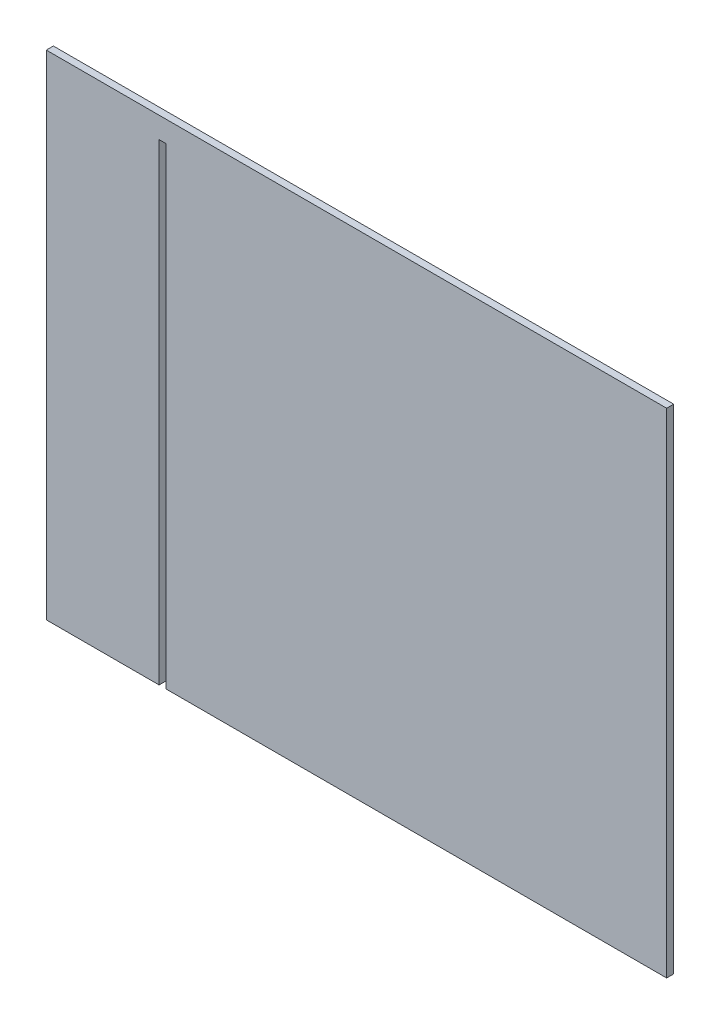
ISO-10303-21;
HEADER;
FILE_DESCRIPTION(('STEP AP214'),'2;1');
FILE_NAME('part.step','',(''),(''),'','','');
FILE_SCHEMA(('AUTOMOTIVE_DESIGN { 1 0 10303 214 1 1 1 1 }'));
ENDSEC;
DATA;
#1=APPLICATION_CONTEXT('core data for automotive mechanical design processes');
#2=APPLICATION_PROTOCOL_DEFINITION('international standard','automotive_design',2000,#1);
#3=PRODUCT_CONTEXT('',#1,'mechanical');
#4=PRODUCT('Part','Part','',(#3));
#5=PRODUCT_RELATED_PRODUCT_CATEGORY('part','',(#4));
#6=PRODUCT_DEFINITION_FORMATION('','',#4);
#7=PRODUCT_DEFINITION_CONTEXT('part definition',#1,'design');
#8=PRODUCT_DEFINITION('design','',#6,#7);
#9=PRODUCT_DEFINITION_SHAPE('','',#8);
#10=(LENGTH_UNIT() NAMED_UNIT(*) SI_UNIT(.MILLI.,.METRE.));
#11=(NAMED_UNIT(*) PLANE_ANGLE_UNIT() SI_UNIT($,.RADIAN.));
#12=(NAMED_UNIT(*) SI_UNIT($,.STERADIAN.) SOLID_ANGLE_UNIT());
#13=UNCERTAINTY_MEASURE_WITH_UNIT(LENGTH_MEASURE(1.E-05),#10,'distance_accuracy_value','');
#14=(GEOMETRIC_REPRESENTATION_CONTEXT(3) GLOBAL_UNCERTAINTY_ASSIGNED_CONTEXT((#13)) GLOBAL_UNIT_ASSIGNED_CONTEXT((#10,
#11,#12)) REPRESENTATION_CONTEXT('',''));
#15=CARTESIAN_POINT('',(0.,0.,0.));
#16=DIRECTION('',(0.,0.,1.));
#17=DIRECTION('',(1.,0.,0.));
#18=AXIS2_PLACEMENT_3D('',#15,#16,#17);
#19=CARTESIAN_POINT('',(-165.668604651163,-234.985465116279,5.));
#20=DIRECTION('',(0.,1.,0.));
#21=DIRECTION('',(0.,0.,1.));
#22=AXIS2_PLACEMENT_3D('',#19,#20,#21);
#23=PLANE('',#22);
#24=DIRECTION('',(1.,0.,0.));
#25=VECTOR('',#24,1.);
#26=CARTESIAN_POINT('',(-165.668604651163,-234.985465116279,0.));
#27=LINE('',#26,#25);
#28=CARTESIAN_POINT('',(-165.668604651163,-234.985465116279,0.));
#29=VERTEX_POINT('',#28);
#30=CARTESIAN_POINT('',(-85.6686046511627,-234.985465116279,0.));
#31=VERTEX_POINT('',#30);
#32=EDGE_CURVE('E118',#29,#31,#27,.T.);
#33=ORIENTED_EDGE('',*,*,#32,.T.);
#34=DIRECTION('',(0.,0.,1.));
#35=VECTOR('',#34,1.);
#36=CARTESIAN_POINT('',(-85.6686046511627,-234.985465116279,0.));
#37=LINE('',#36,#35);
#38=CARTESIAN_POINT('',(-85.6686046511627,-234.985465116279,5.));
#39=VERTEX_POINT('',#38);
#40=EDGE_CURVE('E106',#31,#39,#37,.T.);
#41=ORIENTED_EDGE('',*,*,#40,.T.);
#42=DIRECTION('',(1.,0.,0.));
#43=VECTOR('',#42,1.);
#44=CARTESIAN_POINT('',(-165.668604651163,-234.985465116279,5.));
#45=LINE('',#44,#43);
#46=CARTESIAN_POINT('',(-165.668604651163,-234.985465116279,5.));
#47=VERTEX_POINT('',#46);
#48=EDGE_CURVE('E84',#47,#39,#45,.T.);
#49=ORIENTED_EDGE('',*,*,#48,.F.);
#50=DIRECTION('',(0.,0.,-1.));
#51=VECTOR('',#50,1.);
#52=CARTESIAN_POINT('',(-165.668604651163,-234.985465116279,5.));
#53=LINE('',#52,#51);
#54=EDGE_CURVE('E11',#47,#29,#53,.T.);
#55=ORIENTED_EDGE('',*,*,#54,.T.);
#56=EDGE_LOOP('',(#33,#41,#49,#55));
#57=FACE_BOUND('',#56,.T.);
#58=ADVANCED_FACE('F32',(#57),#23,.F.);
#59=CARTESIAN_POINT('',(-165.668604651163,115.014534883721,5.));
#60=DIRECTION('',(1.,0.,0.));
#61=DIRECTION('',(0.,1.,0.));
#62=AXIS2_PLACEMENT_3D('',#59,#60,#61);
#63=PLANE('',#62);
#64=DIRECTION('',(0.,-1.,0.));
#65=VECTOR('',#64,1.);
#66=CARTESIAN_POINT('',(-165.668604651163,115.014534883721,0.));
#67=LINE('',#66,#65);
#68=CARTESIAN_POINT('',(-165.668604651163,115.014534883721,0.));
#69=VERTEX_POINT('',#68);
#70=EDGE_CURVE('E129',#69,#29,#67,.T.);
#71=ORIENTED_EDGE('',*,*,#70,.T.);
#72=ORIENTED_EDGE('',*,*,#54,.F.);
#73=DIRECTION('',(0.,-1.,0.));
#74=VECTOR('',#73,1.);
#75=CARTESIAN_POINT('',(-165.668604651163,115.014534883721,5.));
#76=LINE('',#75,#74);
#77=CARTESIAN_POINT('',(-165.668604651163,115.014534883721,5.));
#78=VERTEX_POINT('',#77);
#79=EDGE_CURVE('E134',#78,#47,#76,.T.);
#80=ORIENTED_EDGE('',*,*,#79,.F.);
#81=DIRECTION('',(0.,0.,-1.));
#82=VECTOR('',#81,1.);
#83=CARTESIAN_POINT('',(-165.668604651163,115.014534883721,5.));
#84=LINE('',#83,#82);
#85=EDGE_CURVE('E135',#78,#69,#84,.T.);
#86=ORIENTED_EDGE('',*,*,#85,.T.);
#87=EDGE_LOOP('',(#71,#72,#80,#86));
#88=FACE_BOUND('',#87,.T.);
#89=ADVANCED_FACE('F34',(#88),#63,.F.);
#90=CARTESIAN_POINT('',(-80.6686046511627,-234.985465116279,5.));
#91=VERTEX_POINT('',#90);
#92=CARTESIAN_POINT('',(274.331395348837,-234.985465116279,5.));
#93=VERTEX_POINT('',#92);
#94=EDGE_CURVE('E160',#91,#93,#45,.T.);
#95=ORIENTED_EDGE('',*,*,#94,.F.);
#96=DIRECTION('',(0.,0.,1.));
#97=VECTOR('',#96,1.);
#98=CARTESIAN_POINT('',(-80.6686046511627,-234.985465116279,0.));
#99=LINE('',#98,#97);
#100=CARTESIAN_POINT('',(-80.6686046511627,-234.985465116279,0.));
#101=VERTEX_POINT('',#100);
#102=EDGE_CURVE('E113',#101,#91,#99,.T.);
#103=ORIENTED_EDGE('',*,*,#102,.F.);
#104=CARTESIAN_POINT('',(274.331395348837,-234.985465116279,0.));
#105=VERTEX_POINT('',#104);
#106=EDGE_CURVE('E126',#101,#105,#27,.T.);
#107=ORIENTED_EDGE('',*,*,#106,.T.);
#108=DIRECTION('',(0.,0.,-1.));
#109=VECTOR('',#108,1.);
#110=CARTESIAN_POINT('',(274.331395348837,-234.985465116279,5.));
#111=LINE('',#110,#109);
#112=EDGE_CURVE('E40',#93,#105,#111,.T.);
#113=ORIENTED_EDGE('',*,*,#112,.F.);
#114=EDGE_LOOP('',(#95,#103,#107,#113));
#115=FACE_BOUND('',#114,.T.);
#116=ADVANCED_FACE('F175',(#115),#23,.F.);
#117=CARTESIAN_POINT('',(274.331395348837,115.014534883721,5.));
#118=DIRECTION('',(-1.,0.,0.));
#119=DIRECTION('',(0.,-1.,0.));
#120=AXIS2_PLACEMENT_3D('',#117,#118,#119);
#121=PLANE('',#120);
#122=DIRECTION('',(0.,1.,0.));
#123=VECTOR('',#122,1.);
#124=CARTESIAN_POINT('',(274.331395348837,115.014534883721,0.));
#125=LINE('',#124,#123);
#126=CARTESIAN_POINT('',(274.331395348837,115.014534883721,0.));
#127=VERTEX_POINT('',#126);
#128=EDGE_CURVE('E125',#105,#127,#125,.T.);
#129=ORIENTED_EDGE('',*,*,#128,.T.);
#130=DIRECTION('',(0.,0.,-1.));
#131=VECTOR('',#130,1.);
#132=CARTESIAN_POINT('',(274.331395348837,115.014534883721,5.));
#133=LINE('',#132,#131);
#134=CARTESIAN_POINT('',(274.331395348837,115.014534883721,5.));
#135=VERTEX_POINT('',#134);
#136=EDGE_CURVE('E137',#135,#127,#133,.T.);
#137=ORIENTED_EDGE('',*,*,#136,.F.);
#138=DIRECTION('',(0.,1.,0.));
#139=VECTOR('',#138,1.);
#140=CARTESIAN_POINT('',(274.331395348837,115.014534883721,5.));
#141=LINE('',#140,#139);
#142=EDGE_CURVE('E145',#93,#135,#141,.T.);
#143=ORIENTED_EDGE('',*,*,#142,.F.);
#144=ORIENTED_EDGE('',*,*,#112,.T.);
#145=EDGE_LOOP('',(#129,#137,#143,#144));
#146=FACE_BOUND('',#145,.T.);
#147=ADVANCED_FACE('F143',(#146),#121,.F.);
#148=CARTESIAN_POINT('',(-165.668604651163,115.014534883721,5.));
#149=DIRECTION('',(0.,-1.,0.));
#150=DIRECTION('',(0.,0.,-1.));
#151=AXIS2_PLACEMENT_3D('',#148,#149,#150);
#152=PLANE('',#151);
#153=DIRECTION('',(-1.,0.,0.));
#154=VECTOR('',#153,1.);
#155=CARTESIAN_POINT('',(-165.668604651163,115.014534883721,0.));
#156=LINE('',#155,#154);
#157=EDGE_CURVE('E77',#127,#69,#156,.T.);
#158=ORIENTED_EDGE('',*,*,#157,.T.);
#159=ORIENTED_EDGE('',*,*,#85,.F.);
#160=DIRECTION('',(-1.,0.,0.));
#161=VECTOR('',#160,1.);
#162=CARTESIAN_POINT('',(-165.668604651163,115.014534883721,5.));
#163=LINE('',#162,#161);
#164=EDGE_CURVE('E56',#135,#78,#163,.T.);
#165=ORIENTED_EDGE('',*,*,#164,.F.);
#166=ORIENTED_EDGE('',*,*,#136,.T.);
#167=EDGE_LOOP('',(#158,#159,#165,#166));
#168=FACE_BOUND('',#167,.T.);
#169=ADVANCED_FACE('F164',(#168),#152,.F.);
#170=CARTESIAN_POINT('',(0.,0.,5.));
#171=DIRECTION('',(0.,0.,1.));
#172=DIRECTION('',(1.,0.,0.));
#173=AXIS2_PLACEMENT_3D('',#170,#171,#172);
#174=PLANE('',#173);
#175=DIRECTION('',(0.,-1.,0.));
#176=VECTOR('',#175,1.);
#177=CARTESIAN_POINT('',(-85.6686046511627,-234.985465116279,5.));
#178=LINE('',#177,#176);
#179=CARTESIAN_POINT('',(-85.6686046511627,100.014534883721,5.));
#180=VERTEX_POINT('',#179);
#181=EDGE_CURVE('E111',#180,#39,#178,.T.);
#182=ORIENTED_EDGE('',*,*,#181,.F.);
#183=DIRECTION('',(-1.,0.,0.));
#184=VECTOR('',#183,1.);
#185=CARTESIAN_POINT('',(-85.6686046511627,100.014534883721,5.));
#186=LINE('',#185,#184);
#187=CARTESIAN_POINT('',(-80.6686046511627,100.014534883721,5.));
#188=VERTEX_POINT('',#187);
#189=EDGE_CURVE('E121',#188,#180,#186,.T.);
#190=ORIENTED_EDGE('',*,*,#189,.F.);
#191=DIRECTION('',(0.,1.,0.));
#192=VECTOR('',#191,1.);
#193=CARTESIAN_POINT('',(-80.6686046511627,-234.985465116279,5.));
#194=LINE('',#193,#192);
#195=EDGE_CURVE('E167',#91,#188,#194,.T.);
#196=ORIENTED_EDGE('',*,*,#195,.F.);
#197=ORIENTED_EDGE('',*,*,#94,.T.);
#198=ORIENTED_EDGE('',*,*,#142,.T.);
#199=ORIENTED_EDGE('',*,*,#164,.T.);
#200=ORIENTED_EDGE('',*,*,#79,.T.);
#201=ORIENTED_EDGE('',*,*,#48,.T.);
#202=EDGE_LOOP('',(#182,#190,#196,#197,#198,#199,#200,#201));
#203=FACE_BOUND('',#202,.T.);
#204=ADVANCED_FACE('F162',(#203),#174,.T.);
#205=CARTESIAN_POINT('',(0.,0.,0.));
#206=DIRECTION('',(0.,0.,1.));
#207=DIRECTION('',(1.,0.,0.));
#208=AXIS2_PLACEMENT_3D('',#205,#206,#207);
#209=PLANE('',#208);
#210=DIRECTION('',(-1.,0.,0.));
#211=VECTOR('',#210,1.);
#212=CARTESIAN_POINT('',(-85.6686046511627,100.014534883721,0.));
#213=LINE('',#212,#211);
#214=CARTESIAN_POINT('',(-80.6686046511627,100.014534883721,0.));
#215=VERTEX_POINT('',#214);
#216=CARTESIAN_POINT('',(-85.6686046511627,100.014534883721,0.));
#217=VERTEX_POINT('',#216);
#218=EDGE_CURVE('E47',#215,#217,#213,.T.);
#219=ORIENTED_EDGE('',*,*,#218,.T.);
#220=DIRECTION('',(0.,-1.,0.));
#221=VECTOR('',#220,1.);
#222=CARTESIAN_POINT('',(-85.6686046511627,-234.985465116279,0.));
#223=LINE('',#222,#221);
#224=EDGE_CURVE('E109',#217,#31,#223,.T.);
#225=ORIENTED_EDGE('',*,*,#224,.T.);
#226=ORIENTED_EDGE('',*,*,#32,.F.);
#227=ORIENTED_EDGE('',*,*,#70,.F.);
#228=ORIENTED_EDGE('',*,*,#157,.F.);
#229=ORIENTED_EDGE('',*,*,#128,.F.);
#230=ORIENTED_EDGE('',*,*,#106,.F.);
#231=DIRECTION('',(0.,1.,0.));
#232=VECTOR('',#231,1.);
#233=CARTESIAN_POINT('',(-80.6686046511627,-234.985465116279,0.));
#234=LINE('',#233,#232);
#235=EDGE_CURVE('E120',#101,#215,#234,.T.);
#236=ORIENTED_EDGE('',*,*,#235,.T.);
#237=EDGE_LOOP('',(#219,#225,#226,#227,#228,#229,#230,#236));
#238=FACE_BOUND('',#237,.T.);
#239=ADVANCED_FACE('F116',(#238),#209,.F.);
#240=CARTESIAN_POINT('',(-85.6686046511627,-234.985465116279,0.));
#241=DIRECTION('',(-1.,0.,0.));
#242=DIRECTION('',(0.,0.,1.));
#243=AXIS2_PLACEMENT_3D('',#240,#241,#242);
#244=PLANE('',#243);
#245=ORIENTED_EDGE('',*,*,#181,.T.);
#246=ORIENTED_EDGE('',*,*,#40,.F.);
#247=ORIENTED_EDGE('',*,*,#224,.F.);
#248=DIRECTION('',(0.,0.,1.));
#249=VECTOR('',#248,1.);
#250=CARTESIAN_POINT('',(-85.6686046511627,100.014534883721,0.));
#251=LINE('',#250,#249);
#252=EDGE_CURVE('E150',#217,#180,#251,.T.);
#253=ORIENTED_EDGE('',*,*,#252,.T.);
#254=EDGE_LOOP('',(#245,#246,#247,#253));
#255=FACE_BOUND('',#254,.T.);
#256=ADVANCED_FACE('F108',(#255),#244,.F.);
#257=CARTESIAN_POINT('',(-85.6686046511627,100.014534883721,0.));
#258=DIRECTION('',(0.,1.,0.));
#259=DIRECTION('',(-1.,0.,0.));
#260=AXIS2_PLACEMENT_3D('',#257,#258,#259);
#261=PLANE('',#260);
#262=ORIENTED_EDGE('',*,*,#189,.T.);
#263=ORIENTED_EDGE('',*,*,#252,.F.);
#264=ORIENTED_EDGE('',*,*,#218,.F.);
#265=DIRECTION('',(0.,0.,1.));
#266=VECTOR('',#265,1.);
#267=CARTESIAN_POINT('',(-80.6686046511627,100.014534883721,0.));
#268=LINE('',#267,#266);
#269=EDGE_CURVE('E151',#215,#188,#268,.T.);
#270=ORIENTED_EDGE('',*,*,#269,.T.);
#271=EDGE_LOOP('',(#262,#263,#264,#270));
#272=FACE_BOUND('',#271,.T.);
#273=ADVANCED_FACE('F224',(#272),#261,.F.);
#274=CARTESIAN_POINT('',(-80.6686046511627,-234.985465116279,0.));
#275=DIRECTION('',(1.,0.,0.));
#276=DIRECTION('',(0.,0.,-1.));
#277=AXIS2_PLACEMENT_3D('',#274,#275,#276);
#278=PLANE('',#277);
#279=ORIENTED_EDGE('',*,*,#195,.T.);
#280=ORIENTED_EDGE('',*,*,#269,.F.);
#281=ORIENTED_EDGE('',*,*,#235,.F.);
#282=ORIENTED_EDGE('',*,*,#102,.T.);
#283=EDGE_LOOP('',(#279,#280,#281,#282));
#284=FACE_BOUND('',#283,.T.);
#285=ADVANCED_FACE('F174',(#284),#278,.F.);
#286=CLOSED_SHELL('',(#58,#89,#116,#147,#169,#204,#239,#256,#273,#285));
#287=MANIFOLD_SOLID_BREP('B2',#286);
#288=ADVANCED_BREP_SHAPE_REPRESENTATION('',(#18,#287),#14);
#289=SHAPE_DEFINITION_REPRESENTATION(#9,#288);
ENDSEC;
END-ISO-10303-21;
